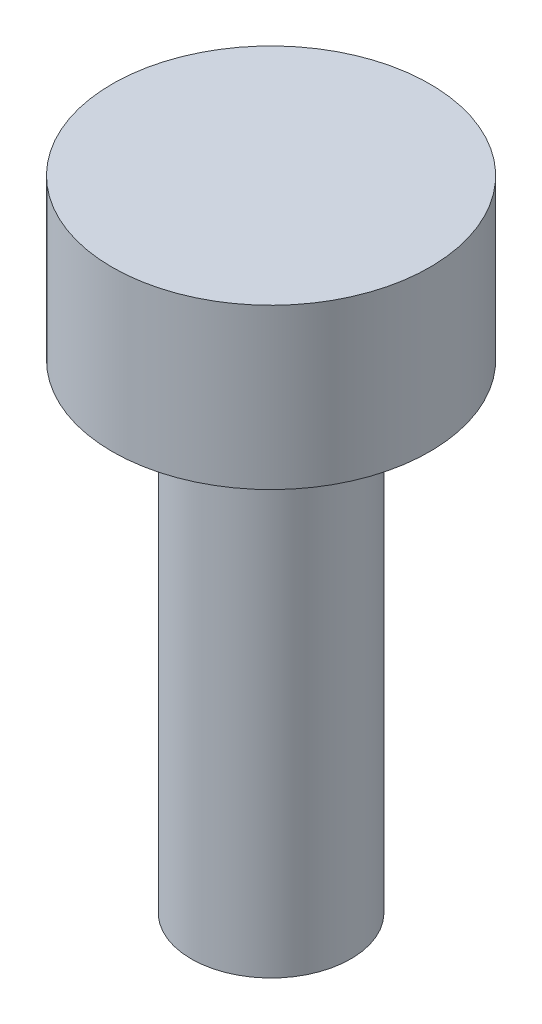
ISO-10303-21;
HEADER;
FILE_DESCRIPTION(('STEP AP214'),'2;1');
FILE_NAME('part.step','',(''),(''),'','','');
FILE_SCHEMA(('AUTOMOTIVE_DESIGN { 1 0 10303 214 1 1 1 1 }'));
ENDSEC;
DATA;
#1=APPLICATION_CONTEXT('core data for automotive mechanical design processes');
#2=APPLICATION_PROTOCOL_DEFINITION('international standard','automotive_design',2000,#1);
#3=PRODUCT_CONTEXT('',#1,'mechanical');
#4=PRODUCT('Part','Part','',(#3));
#5=PRODUCT_RELATED_PRODUCT_CATEGORY('part','',(#4));
#6=PRODUCT_DEFINITION_FORMATION('','',#4);
#7=PRODUCT_DEFINITION_CONTEXT('part definition',#1,'design');
#8=PRODUCT_DEFINITION('design','',#6,#7);
#9=PRODUCT_DEFINITION_SHAPE('','',#8);
#10=(LENGTH_UNIT() NAMED_UNIT(*) SI_UNIT(.MILLI.,.METRE.));
#11=(NAMED_UNIT(*) PLANE_ANGLE_UNIT() SI_UNIT($,.RADIAN.));
#12=(NAMED_UNIT(*) SI_UNIT($,.STERADIAN.) SOLID_ANGLE_UNIT());
#13=UNCERTAINTY_MEASURE_WITH_UNIT(LENGTH_MEASURE(1.E-05),#10,'distance_accuracy_value','');
#14=(GEOMETRIC_REPRESENTATION_CONTEXT(3) GLOBAL_UNCERTAINTY_ASSIGNED_CONTEXT((#13)) GLOBAL_UNIT_ASSIGNED_CONTEXT((#10,
#11,#12)) REPRESENTATION_CONTEXT('',''));
#15=CARTESIAN_POINT('',(0.,0.,0.));
#16=DIRECTION('',(0.,0.,1.));
#17=DIRECTION('',(1.,0.,0.));
#18=AXIS2_PLACEMENT_3D('',#15,#16,#17);
#19=CARTESIAN_POINT('',(-26.2916512459885,67.,-8.5));
#20=DIRECTION('',(0.,1.,0.));
#21=DIRECTION('',(0.,0.,-1.));
#22=AXIS2_PLACEMENT_3D('',#19,#20,#21);
#23=CYLINDRICAL_SURFACE('',#22,1.);
#24=CARTESIAN_POINT('',(-26.2916512459885,67.,-8.5));
#25=DIRECTION('',(0.,1.,0.));
#26=DIRECTION('',(0.,0.,1.));
#27=AXIS2_PLACEMENT_3D('',#24,#25,#26);
#28=CIRCLE('',#27,1.);
#29=CARTESIAN_POINT('',(-26.2916512459885,67.,-7.5));
#30=VERTEX_POINT('',#29);
#31=EDGE_CURVE('E10',#30,#30,#28,.T.);
#32=ORIENTED_EDGE('',*,*,#31,.T.);
#33=EDGE_LOOP('',(#32));
#34=FACE_BOUND('',#33,.T.);
#35=CARTESIAN_POINT('',(-26.2916512459885,73.,-8.5));
#36=DIRECTION('',(0.,1.,0.));
#37=DIRECTION('',(0.,0.,1.));
#38=AXIS2_PLACEMENT_3D('',#35,#36,#37);
#39=CIRCLE('',#38,1.);
#40=CARTESIAN_POINT('',(-26.2916512459885,73.,-7.5));
#41=VERTEX_POINT('',#40);
#42=EDGE_CURVE('E45',#41,#41,#39,.T.);
#43=ORIENTED_EDGE('',*,*,#42,.F.);
#44=EDGE_LOOP('',(#43));
#45=FACE_BOUND('',#44,.T.);
#46=ADVANCED_FACE('F39',(#34,#45),#23,.T.);
#47=CARTESIAN_POINT('',(-26.2916512459885,67.,-8.5));
#48=DIRECTION('',(0.,-1.,0.));
#49=DIRECTION('',(0.,0.,1.));
#50=AXIS2_PLACEMENT_3D('',#47,#48,#49);
#51=PLANE('',#50);
#52=ORIENTED_EDGE('',*,*,#31,.F.);
#53=EDGE_LOOP('',(#52));
#54=FACE_BOUND('',#53,.T.);
#55=ADVANCED_FACE('F72',(#54),#51,.T.);
#56=CARTESIAN_POINT('',(-26.2916512459885,73.,-8.5));
#57=DIRECTION('',(0.,1.,0.));
#58=DIRECTION('',(0.,0.,-1.));
#59=AXIS2_PLACEMENT_3D('',#56,#57,#58);
#60=CYLINDRICAL_SURFACE('',#59,1.99);
#61=CARTESIAN_POINT('',(-26.2916512459885,73.,-8.5));
#62=DIRECTION('',(0.,1.,0.));
#63=DIRECTION('',(0.,0.,1.));
#64=AXIS2_PLACEMENT_3D('',#61,#62,#63);
#65=CIRCLE('',#64,1.99);
#66=CARTESIAN_POINT('',(-26.2916512459885,73.,-6.51));
#67=VERTEX_POINT('',#66);
#68=EDGE_CURVE('E47',#67,#67,#65,.T.);
#69=ORIENTED_EDGE('',*,*,#68,.T.);
#70=EDGE_LOOP('',(#69));
#71=FACE_BOUND('',#70,.T.);
#72=CARTESIAN_POINT('',(-26.2916512459885,75.,-8.5));
#73=DIRECTION('',(0.,1.,0.));
#74=DIRECTION('',(0.,0.,1.));
#75=AXIS2_PLACEMENT_3D('',#72,#73,#74);
#76=CIRCLE('',#75,1.99);
#77=CARTESIAN_POINT('',(-26.2916512459885,75.,-6.51));
#78=VERTEX_POINT('',#77);
#79=EDGE_CURVE('E51',#78,#78,#76,.T.);
#80=ORIENTED_EDGE('',*,*,#79,.F.);
#81=EDGE_LOOP('',(#80));
#82=FACE_BOUND('',#81,.T.);
#83=ADVANCED_FACE('F60',(#71,#82),#60,.T.);
#84=CARTESIAN_POINT('',(-26.2916512459885,73.,-8.5));
#85=DIRECTION('',(0.,-1.,0.));
#86=DIRECTION('',(0.,0.,1.));
#87=AXIS2_PLACEMENT_3D('',#84,#85,#86);
#88=PLANE('',#87);
#89=ORIENTED_EDGE('',*,*,#42,.T.);
#90=EDGE_LOOP('',(#89));
#91=FACE_BOUND('',#90,.T.);
#92=ORIENTED_EDGE('',*,*,#68,.F.);
#93=EDGE_LOOP('',(#92));
#94=FACE_BOUND('',#93,.T.);
#95=ADVANCED_FACE('F58',(#91,#94),#88,.T.);
#96=CARTESIAN_POINT('',(-26.2916512459885,75.,-8.5));
#97=DIRECTION('',(0.,-1.,0.));
#98=DIRECTION('',(0.,0.,1.));
#99=AXIS2_PLACEMENT_3D('',#96,#97,#98);
#100=PLANE('',#99);
#101=ORIENTED_EDGE('',*,*,#79,.T.);
#102=EDGE_LOOP('',(#101));
#103=FACE_BOUND('',#102,.T.);
#104=ADVANCED_FACE('F62',(#103),#100,.F.);
#105=CLOSED_SHELL('',(#46,#55,#83,#95,#104));
#106=MANIFOLD_SOLID_BREP('B2',#105);
#107=ADVANCED_BREP_SHAPE_REPRESENTATION('',(#18,#106),#14);
#108=SHAPE_DEFINITION_REPRESENTATION(#9,#107);
ENDSEC;
END-ISO-10303-21;
